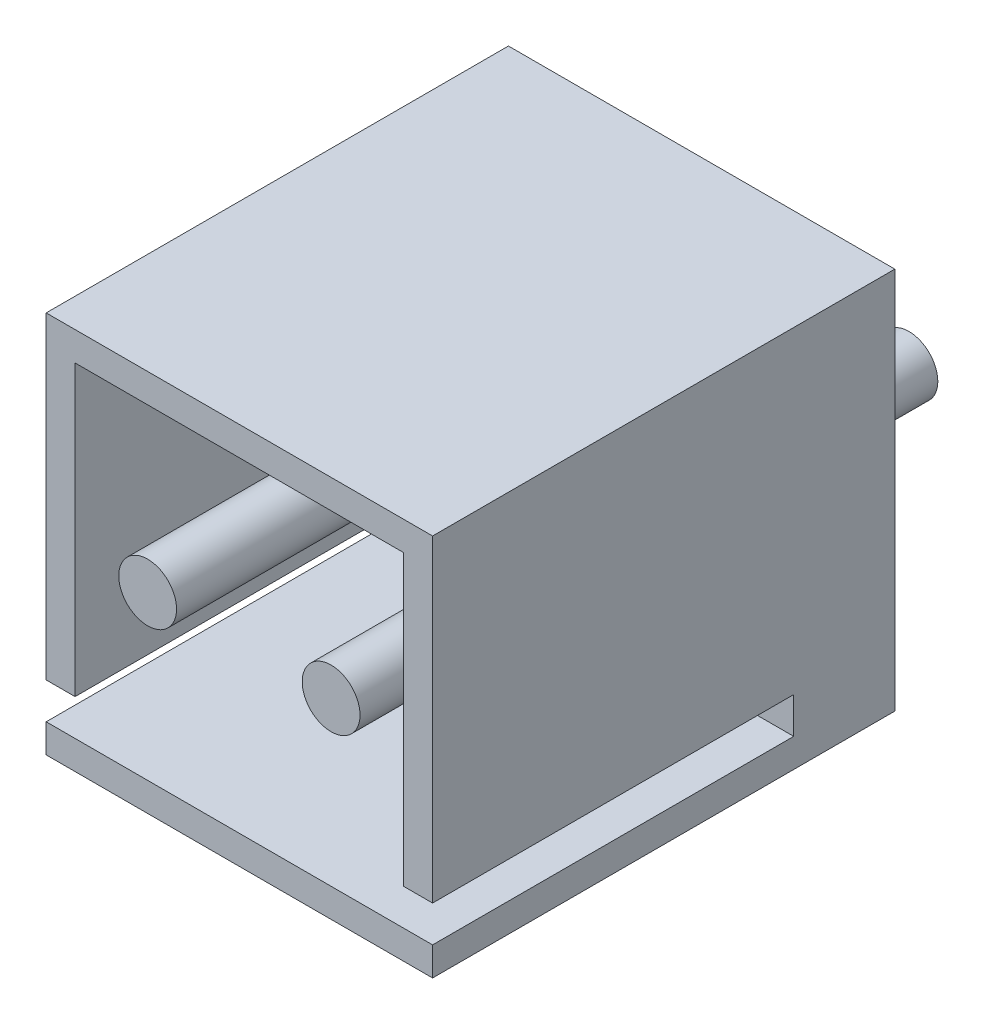
ISO-10303-21;
HEADER;
FILE_DESCRIPTION(('STEP AP214'),'2;1');
FILE_NAME('part.step','',(''),(''),'','','');
FILE_SCHEMA(('AUTOMOTIVE_DESIGN { 1 0 10303 214 1 1 1 1 }'));
ENDSEC;
DATA;
#1=APPLICATION_CONTEXT('core data for automotive mechanical design processes');
#2=APPLICATION_PROTOCOL_DEFINITION('international standard','automotive_design',2000,#1);
#3=PRODUCT_CONTEXT('',#1,'mechanical');
#4=PRODUCT('Part','Part','',(#3));
#5=PRODUCT_RELATED_PRODUCT_CATEGORY('part','',(#4));
#6=PRODUCT_DEFINITION_FORMATION('','',#4);
#7=PRODUCT_DEFINITION_CONTEXT('part definition',#1,'design');
#8=PRODUCT_DEFINITION('design','',#6,#7);
#9=PRODUCT_DEFINITION_SHAPE('','',#8);
#10=(LENGTH_UNIT() NAMED_UNIT(*) SI_UNIT(.MILLI.,.METRE.));
#11=(NAMED_UNIT(*) PLANE_ANGLE_UNIT() SI_UNIT($,.RADIAN.));
#12=(NAMED_UNIT(*) SI_UNIT($,.STERADIAN.) SOLID_ANGLE_UNIT());
#13=UNCERTAINTY_MEASURE_WITH_UNIT(LENGTH_MEASURE(1.E-05),#10,'distance_accuracy_value','');
#14=(GEOMETRIC_REPRESENTATION_CONTEXT(3) GLOBAL_UNCERTAINTY_ASSIGNED_CONTEXT((#13)) GLOBAL_UNIT_ASSIGNED_CONTEXT((#10,
#11,#12)) REPRESENTATION_CONTEXT('',''));
#15=CARTESIAN_POINT('',(0.,0.,0.));
#16=DIRECTION('',(0.,0.,1.));
#17=DIRECTION('',(1.,0.,0.));
#18=AXIS2_PLACEMENT_3D('',#15,#16,#17);
#19=CARTESIAN_POINT('',(-2.675,-2.65,6.4));
#20=DIRECTION('',(0.,0.,1.));
#21=DIRECTION('',(1.,0.,0.));
#22=AXIS2_PLACEMENT_3D('',#19,#20,#21);
#23=PLANE('',#22);
#24=DIRECTION('',(-1.,0.,0.));
#25=VECTOR('',#24,1.);
#26=CARTESIAN_POINT('',(-6.51663395587931,-1.75136681458889,6.4));
#27=LINE('',#26,#25);
#28=CARTESIAN_POINT('',(2.67500000000001,-1.75136681458889,6.4));
#29=VERTEX_POINT('',#28);
#30=CARTESIAN_POINT('',(2.275,-1.75136681458889,6.4));
#31=VERTEX_POINT('',#30);
#32=EDGE_CURVE('E230',#29,#31,#27,.T.);
#33=ORIENTED_EDGE('',*,*,#32,.F.);
#34=DIRECTION('',(0.,1.,0.));
#35=VECTOR('',#34,1.);
#36=CARTESIAN_POINT('',(2.67500000000001,2.65,6.4));
#37=LINE('',#36,#35);
#38=CARTESIAN_POINT('',(2.67500000000001,2.65,6.4));
#39=VERTEX_POINT('',#38);
#40=EDGE_CURVE('E202',#29,#39,#37,.T.);
#41=ORIENTED_EDGE('',*,*,#40,.T.);
#42=DIRECTION('',(-1.,0.,0.));
#43=VECTOR('',#42,1.);
#44=CARTESIAN_POINT('',(-2.675,2.65,6.4));
#45=LINE('',#44,#43);
#46=CARTESIAN_POINT('',(-2.675,2.65,6.4));
#47=VERTEX_POINT('',#46);
#48=EDGE_CURVE('E48',#39,#47,#45,.T.);
#49=ORIENTED_EDGE('',*,*,#48,.T.);
#50=DIRECTION('',(0.,-1.,0.));
#51=VECTOR('',#50,1.);
#52=CARTESIAN_POINT('',(-2.675,2.65,6.4));
#53=LINE('',#52,#51);
#54=CARTESIAN_POINT('',(-2.675,-1.75136681458889,6.4));
#55=VERTEX_POINT('',#54);
#56=EDGE_CURVE('E198',#47,#55,#53,.T.);
#57=ORIENTED_EDGE('',*,*,#56,.T.);
#58=CARTESIAN_POINT('',(-2.275,-1.75136681458889,6.4));
#59=VERTEX_POINT('',#58);
#60=EDGE_CURVE('E137',#59,#55,#27,.T.);
#61=ORIENTED_EDGE('',*,*,#60,.F.);
#62=DIRECTION('',(0.,-1.,0.));
#63=VECTOR('',#62,1.);
#64=CARTESIAN_POINT('',(-2.275,2.25,6.4));
#65=LINE('',#64,#63);
#66=CARTESIAN_POINT('',(-2.275,2.25,6.4));
#67=VERTEX_POINT('',#66);
#68=EDGE_CURVE('E177',#67,#59,#65,.T.);
#69=ORIENTED_EDGE('',*,*,#68,.F.);
#70=DIRECTION('',(-1.,0.,0.));
#71=VECTOR('',#70,1.);
#72=CARTESIAN_POINT('',(2.27500000000001,2.25,6.4));
#73=LINE('',#72,#71);
#74=CARTESIAN_POINT('',(2.27500000000001,2.25,6.4));
#75=VERTEX_POINT('',#74);
#76=EDGE_CURVE('E182',#75,#67,#73,.T.);
#77=ORIENTED_EDGE('',*,*,#76,.F.);
#78=DIRECTION('',(0.,1.,0.));
#79=VECTOR('',#78,1.);
#80=CARTESIAN_POINT('',(2.275,-2.25,6.4));
#81=LINE('',#80,#79);
#82=EDGE_CURVE('E189',#31,#75,#81,.T.);
#83=ORIENTED_EDGE('',*,*,#82,.F.);
#84=EDGE_LOOP('',(#33,#41,#49,#57,#61,#69,#77,#83));
#85=FACE_BOUND('',#84,.T.);
#86=ADVANCED_FACE('F31',(#85),#23,.T.);
#87=CARTESIAN_POINT('',(-2.675,2.65,6.4));
#88=DIRECTION('',(1.,0.,0.));
#89=DIRECTION('',(0.,0.,-1.));
#90=AXIS2_PLACEMENT_3D('',#87,#88,#89);
#91=PLANE('',#90);
#92=DIRECTION('',(0.,-1.,0.));
#93=VECTOR('',#92,1.);
#94=CARTESIAN_POINT('',(-2.675,2.65,1.4));
#95=LINE('',#94,#93);
#96=CARTESIAN_POINT('',(-2.675,-1.75136681458889,1.4));
#97=VERTEX_POINT('',#96);
#98=CARTESIAN_POINT('',(-2.675,-2.25284277885296,1.4));
#99=VERTEX_POINT('',#98);
#100=EDGE_CURVE('E150',#97,#99,#95,.T.);
#101=ORIENTED_EDGE('',*,*,#100,.F.);
#102=DIRECTION('',(0.,0.,1.));
#103=VECTOR('',#102,1.);
#104=CARTESIAN_POINT('',(-2.675,-1.75136681458889,6.4));
#105=LINE('',#104,#103);
#106=EDGE_CURVE('E131',#97,#55,#105,.T.);
#107=ORIENTED_EDGE('',*,*,#106,.T.);
#108=ORIENTED_EDGE('',*,*,#56,.F.);
#109=DIRECTION('',(0.,0.,-1.));
#110=VECTOR('',#109,1.);
#111=CARTESIAN_POINT('',(-2.675,2.65,6.4));
#112=LINE('',#111,#110);
#113=CARTESIAN_POINT('',(-2.675,2.65,0.));
#114=VERTEX_POINT('',#113);
#115=EDGE_CURVE('E207',#47,#114,#112,.T.);
#116=ORIENTED_EDGE('',*,*,#115,.T.);
#117=DIRECTION('',(0.,-1.,0.));
#118=VECTOR('',#117,1.);
#119=CARTESIAN_POINT('',(-2.675,2.65,0.));
#120=LINE('',#119,#118);
#121=CARTESIAN_POINT('',(-2.675,-2.65,0.));
#122=VERTEX_POINT('',#121);
#123=EDGE_CURVE('E195',#114,#122,#120,.T.);
#124=ORIENTED_EDGE('',*,*,#123,.T.);
#125=DIRECTION('',(0.,0.,-1.));
#126=VECTOR('',#125,1.);
#127=CARTESIAN_POINT('',(-2.675,-2.65,6.4));
#128=LINE('',#127,#126);
#129=CARTESIAN_POINT('',(-2.675,-2.65,6.4));
#130=VERTEX_POINT('',#129);
#131=EDGE_CURVE('E11',#130,#122,#128,.T.);
#132=ORIENTED_EDGE('',*,*,#131,.F.);
#133=CARTESIAN_POINT('',(-2.675,-2.25284277885296,6.4));
#134=VERTEX_POINT('',#133);
#135=EDGE_CURVE('E80',#134,#130,#53,.T.);
#136=ORIENTED_EDGE('',*,*,#135,.F.);
#137=DIRECTION('',(0.,0.,-1.));
#138=VECTOR('',#137,1.);
#139=CARTESIAN_POINT('',(-2.675,-2.25284277885296,6.4));
#140=LINE('',#139,#138);
#141=EDGE_CURVE('E159',#134,#99,#140,.T.);
#142=ORIENTED_EDGE('',*,*,#141,.T.);
#143=EDGE_LOOP('',(#101,#107,#108,#116,#124,#132,#136,#142));
#144=FACE_BOUND('',#143,.T.);
#145=ADVANCED_FACE('F33',(#144),#91,.F.);
#146=CARTESIAN_POINT('',(-2.675,-2.65,6.4));
#147=DIRECTION('',(0.,1.,0.));
#148=DIRECTION('',(0.,0.,1.));
#149=AXIS2_PLACEMENT_3D('',#146,#147,#148);
#150=PLANE('',#149);
#151=DIRECTION('',(1.,0.,0.));
#152=VECTOR('',#151,1.);
#153=CARTESIAN_POINT('',(-2.675,-2.65,0.));
#154=LINE('',#153,#152);
#155=CARTESIAN_POINT('',(2.675,-2.65,0.));
#156=VERTEX_POINT('',#155);
#157=EDGE_CURVE('E210',#122,#156,#154,.T.);
#158=ORIENTED_EDGE('',*,*,#157,.T.);
#159=DIRECTION('',(0.,0.,-1.));
#160=VECTOR('',#159,1.);
#161=CARTESIAN_POINT('',(2.675,-2.65,6.4));
#162=LINE('',#161,#160);
#163=CARTESIAN_POINT('',(2.675,-2.65,6.4));
#164=VERTEX_POINT('',#163);
#165=EDGE_CURVE('E40',#164,#156,#162,.T.);
#166=ORIENTED_EDGE('',*,*,#165,.F.);
#167=DIRECTION('',(1.,0.,0.));
#168=VECTOR('',#167,1.);
#169=CARTESIAN_POINT('',(-2.675,-2.65,6.4));
#170=LINE('',#169,#168);
#171=EDGE_CURVE('E200',#130,#164,#170,.T.);
#172=ORIENTED_EDGE('',*,*,#171,.F.);
#173=ORIENTED_EDGE('',*,*,#131,.T.);
#174=EDGE_LOOP('',(#158,#166,#172,#173));
#175=FACE_BOUND('',#174,.T.);
#176=ADVANCED_FACE('F257',(#175),#150,.F.);
#177=CARTESIAN_POINT('',(2.67500000000001,2.65,6.4));
#178=DIRECTION('',(-1.,0.,0.));
#179=DIRECTION('',(0.,-1.,0.));
#180=AXIS2_PLACEMENT_3D('',#177,#178,#179);
#181=PLANE('',#180);
#182=ORIENTED_EDGE('',*,*,#40,.F.);
#183=DIRECTION('',(0.,0.,-1.));
#184=VECTOR('',#183,1.);
#185=CARTESIAN_POINT('',(2.675,-1.75136681458889,6.4));
#186=LINE('',#185,#184);
#187=CARTESIAN_POINT('',(2.675,-1.75136681458889,1.4));
#188=VERTEX_POINT('',#187);
#189=EDGE_CURVE('E142',#29,#188,#186,.T.);
#190=ORIENTED_EDGE('',*,*,#189,.T.);
#191=DIRECTION('',(0.,1.,0.));
#192=VECTOR('',#191,1.);
#193=CARTESIAN_POINT('',(2.67500000000001,2.65,1.4));
#194=LINE('',#193,#192);
#195=CARTESIAN_POINT('',(2.675,-2.25284277885296,1.4));
#196=VERTEX_POINT('',#195);
#197=EDGE_CURVE('E141',#196,#188,#194,.T.);
#198=ORIENTED_EDGE('',*,*,#197,.F.);
#199=DIRECTION('',(0.,0.,1.));
#200=VECTOR('',#199,1.);
#201=CARTESIAN_POINT('',(2.675,-2.25284277885296,6.4));
#202=LINE('',#201,#200);
#203=CARTESIAN_POINT('',(2.67500000000001,-2.25284277885296,6.4));
#204=VERTEX_POINT('',#203);
#205=EDGE_CURVE('E160',#196,#204,#202,.T.);
#206=ORIENTED_EDGE('',*,*,#205,.T.);
#207=EDGE_CURVE('E203',#164,#204,#37,.T.);
#208=ORIENTED_EDGE('',*,*,#207,.F.);
#209=ORIENTED_EDGE('',*,*,#165,.T.);
#210=DIRECTION('',(0.,1.,0.));
#211=VECTOR('',#210,1.);
#212=CARTESIAN_POINT('',(2.67500000000001,2.65,0.));
#213=LINE('',#212,#211);
#214=CARTESIAN_POINT('',(2.67500000000001,2.65,0.));
#215=VERTEX_POINT('',#214);
#216=EDGE_CURVE('E66',#156,#215,#213,.T.);
#217=ORIENTED_EDGE('',*,*,#216,.T.);
#218=DIRECTION('',(0.,0.,-1.));
#219=VECTOR('',#218,1.);
#220=CARTESIAN_POINT('',(2.67500000000001,2.65,6.4));
#221=LINE('',#220,#219);
#222=EDGE_CURVE('E215',#39,#215,#221,.T.);
#223=ORIENTED_EDGE('',*,*,#222,.F.);
#224=EDGE_LOOP('',(#182,#190,#198,#206,#208,#209,#217,#223));
#225=FACE_BOUND('',#224,.T.);
#226=ADVANCED_FACE('F219',(#225),#181,.F.);
#227=CARTESIAN_POINT('',(-2.675,2.65,6.4));
#228=DIRECTION('',(0.,-1.,0.));
#229=DIRECTION('',(1.,0.,0.));
#230=AXIS2_PLACEMENT_3D('',#227,#228,#229);
#231=PLANE('',#230);
#232=DIRECTION('',(-1.,0.,0.));
#233=VECTOR('',#232,1.);
#234=CARTESIAN_POINT('',(-2.675,2.65,0.));
#235=LINE('',#234,#233);
#236=EDGE_CURVE('E72',#215,#114,#235,.T.);
#237=ORIENTED_EDGE('',*,*,#236,.T.);
#238=ORIENTED_EDGE('',*,*,#115,.F.);
#239=ORIENTED_EDGE('',*,*,#48,.F.);
#240=ORIENTED_EDGE('',*,*,#222,.T.);
#241=EDGE_LOOP('',(#237,#238,#239,#240));
#242=FACE_BOUND('',#241,.T.);
#243=ADVANCED_FACE('F225',(#242),#231,.F.);
#244=DIRECTION('',(1.,0.,0.));
#245=VECTOR('',#244,1.);
#246=CARTESIAN_POINT('',(-6.51663395587931,-2.25284277885296,6.4));
#247=LINE('',#246,#245);
#248=EDGE_CURVE('E236',#134,#204,#247,.T.);
#249=ORIENTED_EDGE('',*,*,#248,.F.);
#250=ORIENTED_EDGE('',*,*,#135,.T.);
#251=ORIENTED_EDGE('',*,*,#171,.T.);
#252=ORIENTED_EDGE('',*,*,#207,.T.);
#253=EDGE_LOOP('',(#249,#250,#251,#252));
#254=FACE_BOUND('',#253,.T.);
#255=ADVANCED_FACE('F256',(#254),#23,.T.);
#256=CARTESIAN_POINT('',(-2.675,-2.65,0.));
#257=DIRECTION('',(0.,0.,1.));
#258=DIRECTION('',(1.,0.,0.));
#259=AXIS2_PLACEMENT_3D('',#256,#257,#258);
#260=PLANE('',#259);
#261=CARTESIAN_POINT('',(1.27,0.,0.));
#262=DIRECTION('',(0.,0.,1.));
#263=DIRECTION('',(1.,0.,0.));
#264=AXIS2_PLACEMENT_3D('',#261,#262,#263);
#265=CIRCLE('',#264,0.4);
#266=CARTESIAN_POINT('',(1.67,0.,0.));
#267=VERTEX_POINT('',#266);
#268=EDGE_CURVE('E455',#267,#267,#265,.T.);
#269=ORIENTED_EDGE('',*,*,#268,.T.);
#270=EDGE_LOOP('',(#269));
#271=FACE_BOUND('',#270,.T.);
#272=CARTESIAN_POINT('',(-1.27,0.,0.));
#273=DIRECTION('',(0.,0.,1.));
#274=DIRECTION('',(1.,0.,0.));
#275=AXIS2_PLACEMENT_3D('',#272,#273,#274);
#276=CIRCLE('',#275,0.4);
#277=CARTESIAN_POINT('',(-0.87,0.,0.));
#278=VERTEX_POINT('',#277);
#279=EDGE_CURVE('E463',#278,#278,#276,.T.);
#280=ORIENTED_EDGE('',*,*,#279,.T.);
#281=EDGE_LOOP('',(#280));
#282=FACE_BOUND('',#281,.T.);
#283=ORIENTED_EDGE('',*,*,#123,.F.);
#284=ORIENTED_EDGE('',*,*,#236,.F.);
#285=ORIENTED_EDGE('',*,*,#216,.F.);
#286=ORIENTED_EDGE('',*,*,#157,.F.);
#287=EDGE_LOOP('',(#283,#284,#285,#286));
#288=FACE_BOUND('',#287,.T.);
#289=ADVANCED_FACE('F223',(#271,#282,#288),#260,.F.);
#290=CARTESIAN_POINT('',(-2.275,2.25,1.4));
#291=DIRECTION('',(-1.,0.,0.));
#292=DIRECTION('',(0.,0.,1.));
#293=AXIS2_PLACEMENT_3D('',#290,#291,#292);
#294=PLANE('',#293);
#295=ORIENTED_EDGE('',*,*,#68,.T.);
#296=DIRECTION('',(0.,0.,-1.));
#297=VECTOR('',#296,1.);
#298=CARTESIAN_POINT('',(-2.275,-1.75136681458889,1.4));
#299=LINE('',#298,#297);
#300=CARTESIAN_POINT('',(-2.275,-1.75136681458889,1.4));
#301=VERTEX_POINT('',#300);
#302=EDGE_CURVE('E242',#59,#301,#299,.T.);
#303=ORIENTED_EDGE('',*,*,#302,.T.);
#304=DIRECTION('',(0.,-1.,0.));
#305=VECTOR('',#304,1.);
#306=CARTESIAN_POINT('',(-2.275,2.25,1.4));
#307=LINE('',#306,#305);
#308=CARTESIAN_POINT('',(-2.275,2.25,1.4));
#309=VERTEX_POINT('',#308);
#310=EDGE_CURVE('E154',#309,#301,#307,.T.);
#311=ORIENTED_EDGE('',*,*,#310,.F.);
#312=DIRECTION('',(0.,0.,1.));
#313=VECTOR('',#312,1.);
#314=CARTESIAN_POINT('',(-2.275,2.25,1.4));
#315=LINE('',#314,#313);
#316=EDGE_CURVE('E193',#309,#67,#315,.T.);
#317=ORIENTED_EDGE('',*,*,#316,.T.);
#318=EDGE_LOOP('',(#295,#303,#311,#317));
#319=FACE_BOUND('',#318,.T.);
#320=ADVANCED_FACE('F245',(#319),#294,.F.);
#321=CARTESIAN_POINT('',(2.27500000000001,2.25,1.4));
#322=DIRECTION('',(0.,1.,0.));
#323=DIRECTION('',(-1.,0.,0.));
#324=AXIS2_PLACEMENT_3D('',#321,#322,#323);
#325=PLANE('',#324);
#326=ORIENTED_EDGE('',*,*,#76,.T.);
#327=ORIENTED_EDGE('',*,*,#316,.F.);
#328=DIRECTION('',(-1.,0.,0.));
#329=VECTOR('',#328,1.);
#330=CARTESIAN_POINT('',(2.27500000000001,2.25,1.4));
#331=LINE('',#330,#329);
#332=CARTESIAN_POINT('',(2.27500000000001,2.25,1.4));
#333=VERTEX_POINT('',#332);
#334=EDGE_CURVE('E184',#333,#309,#331,.T.);
#335=ORIENTED_EDGE('',*,*,#334,.F.);
#336=DIRECTION('',(0.,0.,1.));
#337=VECTOR('',#336,1.);
#338=CARTESIAN_POINT('',(2.27500000000001,2.25,1.4));
#339=LINE('',#338,#337);
#340=EDGE_CURVE('E186',#333,#75,#339,.T.);
#341=ORIENTED_EDGE('',*,*,#340,.T.);
#342=EDGE_LOOP('',(#326,#327,#335,#341));
#343=FACE_BOUND('',#342,.T.);
#344=ADVANCED_FACE('F248',(#343),#325,.F.);
#345=CARTESIAN_POINT('',(2.275,-2.25,1.4));
#346=DIRECTION('',(1.,0.,0.));
#347=DIRECTION('',(0.,1.,0.));
#348=AXIS2_PLACEMENT_3D('',#345,#346,#347);
#349=PLANE('',#348);
#350=DIRECTION('',(0.,1.,0.));
#351=VECTOR('',#350,1.);
#352=CARTESIAN_POINT('',(2.275,-2.25,1.4));
#353=LINE('',#352,#351);
#354=CARTESIAN_POINT('',(2.27500000000001,-1.75136681458889,1.4));
#355=VERTEX_POINT('',#354);
#356=EDGE_CURVE('E181',#355,#333,#353,.T.);
#357=ORIENTED_EDGE('',*,*,#356,.F.);
#358=DIRECTION('',(0.,0.,1.));
#359=VECTOR('',#358,1.);
#360=CARTESIAN_POINT('',(2.275,-1.75136681458889,1.4));
#361=LINE('',#360,#359);
#362=EDGE_CURVE('E240',#355,#31,#361,.T.);
#363=ORIENTED_EDGE('',*,*,#362,.T.);
#364=ORIENTED_EDGE('',*,*,#82,.T.);
#365=ORIENTED_EDGE('',*,*,#340,.F.);
#366=EDGE_LOOP('',(#357,#363,#364,#365));
#367=FACE_BOUND('',#366,.T.);
#368=ADVANCED_FACE('F253',(#367),#349,.F.);
#369=CARTESIAN_POINT('',(-2.275,-2.25,1.4));
#370=DIRECTION('',(0.,0.,1.));
#371=DIRECTION('',(1.,0.,0.));
#372=AXIS2_PLACEMENT_3D('',#369,#370,#371);
#373=PLANE('',#372);
#374=DIRECTION('',(1.,0.,0.));
#375=VECTOR('',#374,1.);
#376=CARTESIAN_POINT('',(-6.51663395587931,-1.75136681458889,1.4));
#377=LINE('',#376,#375);
#378=EDGE_CURVE('E156',#355,#188,#377,.T.);
#379=ORIENTED_EDGE('',*,*,#378,.F.);
#380=ORIENTED_EDGE('',*,*,#356,.T.);
#381=ORIENTED_EDGE('',*,*,#334,.T.);
#382=ORIENTED_EDGE('',*,*,#310,.T.);
#383=EDGE_CURVE('E134',#97,#301,#377,.T.);
#384=ORIENTED_EDGE('',*,*,#383,.F.);
#385=ORIENTED_EDGE('',*,*,#100,.T.);
#386=DIRECTION('',(-1.,0.,0.));
#387=VECTOR('',#386,1.);
#388=CARTESIAN_POINT('',(-6.51663395587931,-2.25284277885296,1.4));
#389=LINE('',#388,#387);
#390=EDGE_CURVE('E155',#196,#99,#389,.T.);
#391=ORIENTED_EDGE('',*,*,#390,.F.);
#392=ORIENTED_EDGE('',*,*,#197,.T.);
#393=EDGE_LOOP('',(#379,#380,#381,#382,#384,#385,#391,#392));
#394=FACE_BOUND('',#393,.T.);
#395=CARTESIAN_POINT('',(1.27,0.,1.4));
#396=DIRECTION('',(0.,0.,1.));
#397=DIRECTION('',(1.,0.,0.));
#398=AXIS2_PLACEMENT_3D('',#395,#396,#397);
#399=CIRCLE('',#398,0.4);
#400=CARTESIAN_POINT('',(1.67,0.,1.4));
#401=VERTEX_POINT('',#400);
#402=EDGE_CURVE('E168',#401,#401,#399,.T.);
#403=ORIENTED_EDGE('',*,*,#402,.F.);
#404=EDGE_LOOP('',(#403));
#405=FACE_BOUND('',#404,.T.);
#406=CARTESIAN_POINT('',(-1.27,0.,1.4));
#407=DIRECTION('',(0.,0.,1.));
#408=DIRECTION('',(1.,0.,0.));
#409=AXIS2_PLACEMENT_3D('',#406,#407,#408);
#410=CIRCLE('',#409,0.4);
#411=CARTESIAN_POINT('',(-0.87,0.,1.4));
#412=VERTEX_POINT('',#411);
#413=EDGE_CURVE('E174',#412,#412,#410,.T.);
#414=ORIENTED_EDGE('',*,*,#413,.F.);
#415=EDGE_LOOP('',(#414));
#416=FACE_BOUND('',#415,.T.);
#417=ADVANCED_FACE('F147',(#394,#405,#416),#373,.T.);
#418=CARTESIAN_POINT('',(-1.27,0.,1.4));
#419=DIRECTION('',(0.,0.,1.));
#420=DIRECTION('',(1.,0.,0.));
#421=AXIS2_PLACEMENT_3D('',#418,#419,#420);
#422=CYLINDRICAL_SURFACE('',#421,0.4);
#423=ORIENTED_EDGE('',*,*,#413,.T.);
#424=EDGE_LOOP('',(#423));
#425=FACE_BOUND('',#424,.T.);
#426=CARTESIAN_POINT('',(-1.27,0.,6.4));
#427=DIRECTION('',(0.,0.,1.));
#428=DIRECTION('',(1.,0.,0.));
#429=AXIS2_PLACEMENT_3D('',#426,#427,#428);
#430=CIRCLE('',#429,0.4);
#431=CARTESIAN_POINT('',(-0.87,0.,6.4));
#432=VERTEX_POINT('',#431);
#433=EDGE_CURVE('E171',#432,#432,#430,.T.);
#434=ORIENTED_EDGE('',*,*,#433,.F.);
#435=EDGE_LOOP('',(#434));
#436=FACE_BOUND('',#435,.T.);
#437=ADVANCED_FACE('F292',(#425,#436),#422,.T.);
#438=CARTESIAN_POINT('',(1.27,0.,1.4));
#439=DIRECTION('',(0.,0.,1.));
#440=DIRECTION('',(1.,0.,0.));
#441=AXIS2_PLACEMENT_3D('',#438,#439,#440);
#442=CYLINDRICAL_SURFACE('',#441,0.4);
#443=ORIENTED_EDGE('',*,*,#402,.T.);
#444=EDGE_LOOP('',(#443));
#445=FACE_BOUND('',#444,.T.);
#446=CARTESIAN_POINT('',(1.27,0.,6.4));
#447=DIRECTION('',(0.,0.,1.));
#448=DIRECTION('',(1.,0.,0.));
#449=AXIS2_PLACEMENT_3D('',#446,#447,#448);
#450=CIRCLE('',#449,0.4);
#451=CARTESIAN_POINT('',(1.67,0.,6.4));
#452=VERTEX_POINT('',#451);
#453=EDGE_CURVE('E167',#452,#452,#450,.T.);
#454=ORIENTED_EDGE('',*,*,#453,.F.);
#455=EDGE_LOOP('',(#454));
#456=FACE_BOUND('',#455,.T.);
#457=ADVANCED_FACE('F273',(#445,#456),#442,.T.);
#458=ORIENTED_EDGE('',*,*,#433,.T.);
#459=EDGE_LOOP('',(#458));
#460=FACE_BOUND('',#459,.T.);
#461=ADVANCED_FACE('F266',(#460),#23,.T.);
#462=ORIENTED_EDGE('',*,*,#453,.T.);
#463=EDGE_LOOP('',(#462));
#464=FACE_BOUND('',#463,.T.);
#465=ADVANCED_FACE('F272',(#464),#23,.T.);
#466=CARTESIAN_POINT('',(-6.51663395587931,-2.25284277885296,-11.5091604774039));
#467=DIRECTION('',(0.,-1.,0.));
#468=DIRECTION('',(0.,0.,-1.));
#469=AXIS2_PLACEMENT_3D('',#466,#467,#468);
#470=PLANE('',#469);
#471=ORIENTED_EDGE('',*,*,#248,.T.);
#472=ORIENTED_EDGE('',*,*,#205,.F.);
#473=ORIENTED_EDGE('',*,*,#390,.T.);
#474=ORIENTED_EDGE('',*,*,#141,.F.);
#475=EDGE_LOOP('',(#471,#472,#473,#474));
#476=FACE_BOUND('',#475,.T.);
#477=ADVANCED_FACE('F283',(#476),#470,.F.);
#478=CARTESIAN_POINT('',(-6.51663395587931,-1.75136681458889,-11.5091604774039));
#479=DIRECTION('',(0.,1.,0.));
#480=DIRECTION('',(0.,0.,1.));
#481=AXIS2_PLACEMENT_3D('',#478,#479,#480);
#482=PLANE('',#481);
#483=ORIENTED_EDGE('',*,*,#383,.T.);
#484=ORIENTED_EDGE('',*,*,#302,.F.);
#485=ORIENTED_EDGE('',*,*,#60,.T.);
#486=ORIENTED_EDGE('',*,*,#106,.F.);
#487=EDGE_LOOP('',(#483,#484,#485,#486));
#488=FACE_BOUND('',#487,.T.);
#489=ADVANCED_FACE('F133',(#488),#482,.F.);
#490=ORIENTED_EDGE('',*,*,#32,.T.);
#491=ORIENTED_EDGE('',*,*,#362,.F.);
#492=ORIENTED_EDGE('',*,*,#378,.T.);
#493=ORIENTED_EDGE('',*,*,#189,.F.);
#494=EDGE_LOOP('',(#490,#491,#492,#493));
#495=FACE_BOUND('',#494,.T.);
#496=ADVANCED_FACE('F254',(#495),#482,.F.);
#497=CARTESIAN_POINT('',(-1.27,0.,-1.6));
#498=DIRECTION('',(0.,0.,1.));
#499=DIRECTION('',(1.,0.,0.));
#500=AXIS2_PLACEMENT_3D('',#497,#498,#499);
#501=CYLINDRICAL_SURFACE('',#500,0.4);
#502=CARTESIAN_POINT('',(-1.27,0.,-1.6));
#503=DIRECTION('',(0.,0.,1.));
#504=DIRECTION('',(1.,0.,0.));
#505=AXIS2_PLACEMENT_3D('',#502,#503,#504);
#506=CIRCLE('',#505,0.4);
#507=CARTESIAN_POINT('',(-0.87,0.,-1.6));
#508=VERTEX_POINT('',#507);
#509=EDGE_CURVE('E458',#508,#508,#506,.T.);
#510=ORIENTED_EDGE('',*,*,#509,.T.);
#511=EDGE_LOOP('',(#510));
#512=FACE_BOUND('',#511,.T.);
#513=ORIENTED_EDGE('',*,*,#279,.F.);
#514=EDGE_LOOP('',(#513));
#515=FACE_BOUND('',#514,.T.);
#516=ADVANCED_FACE('F383',(#512,#515),#501,.T.);
#517=CARTESIAN_POINT('',(-1.27,0.,-1.6));
#518=DIRECTION('',(0.,0.,1.));
#519=DIRECTION('',(1.,0.,0.));
#520=AXIS2_PLACEMENT_3D('',#517,#518,#519);
#521=PLANE('',#520);
#522=ORIENTED_EDGE('',*,*,#509,.F.);
#523=EDGE_LOOP('',(#522));
#524=FACE_BOUND('',#523,.T.);
#525=ADVANCED_FACE('F388',(#524),#521,.F.);
#526=CARTESIAN_POINT('',(1.27,0.,-1.6));
#527=DIRECTION('',(0.,0.,1.));
#528=DIRECTION('',(1.,0.,0.));
#529=AXIS2_PLACEMENT_3D('',#526,#527,#528);
#530=CYLINDRICAL_SURFACE('',#529,0.4);
#531=CARTESIAN_POINT('',(1.27,0.,-1.6));
#532=DIRECTION('',(0.,0.,1.));
#533=DIRECTION('',(1.,0.,0.));
#534=AXIS2_PLACEMENT_3D('',#531,#532,#533);
#535=CIRCLE('',#534,0.4);
#536=CARTESIAN_POINT('',(1.67,0.,-1.6));
#537=VERTEX_POINT('',#536);
#538=EDGE_CURVE('E454',#537,#537,#535,.T.);
#539=ORIENTED_EDGE('',*,*,#538,.T.);
#540=EDGE_LOOP('',(#539));
#541=FACE_BOUND('',#540,.T.);
#542=ORIENTED_EDGE('',*,*,#268,.F.);
#543=EDGE_LOOP('',(#542));
#544=FACE_BOUND('',#543,.T.);
#545=ADVANCED_FACE('F398',(#541,#544),#530,.T.);
#546=CARTESIAN_POINT('',(1.27,0.,-1.6));
#547=DIRECTION('',(0.,0.,1.));
#548=DIRECTION('',(1.,0.,0.));
#549=AXIS2_PLACEMENT_3D('',#546,#547,#548);
#550=PLANE('',#549);
#551=ORIENTED_EDGE('',*,*,#538,.F.);
#552=EDGE_LOOP('',(#551));
#553=FACE_BOUND('',#552,.T.);
#554=ADVANCED_FACE('F408',(#553),#550,.F.);
#555=CLOSED_SHELL('',(#86,#145,#176,#226,#243,#255,#289,#320,#344,#368,#417,#437,#457,#461,#465,
#477,#489,#496,#516,#525,#545,#554));
#556=MANIFOLD_SOLID_BREP('B2',#555);
#557=ADVANCED_BREP_SHAPE_REPRESENTATION('',(#18,#556),#14);
#558=SHAPE_DEFINITION_REPRESENTATION(#9,#557);
ENDSEC;
END-ISO-10303-21;
